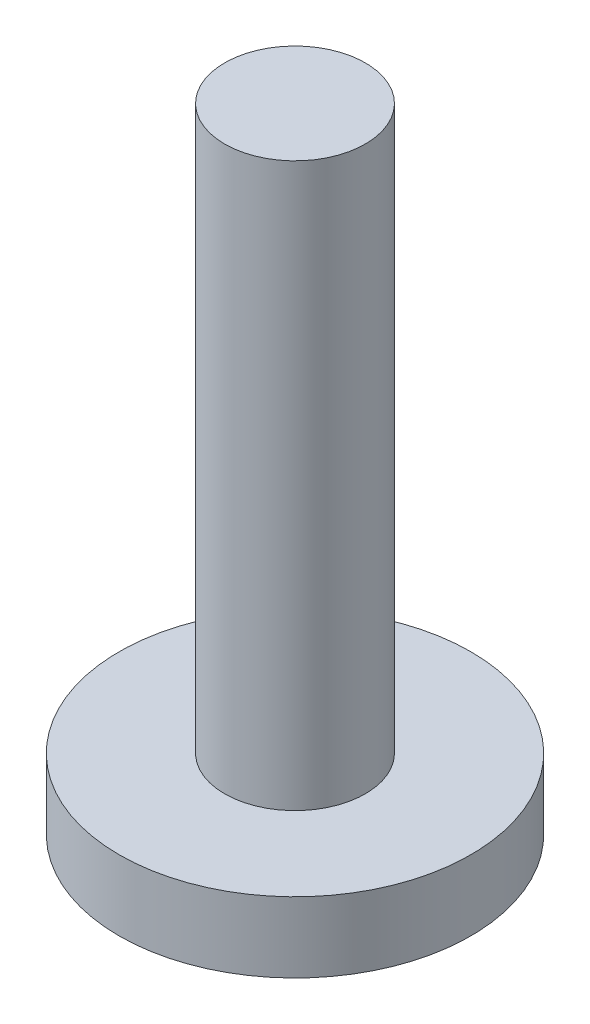
ISO-10303-21;
HEADER;
FILE_DESCRIPTION(('STEP AP214'),'2;1');
FILE_NAME('part.step','',(''),(''),'','','');
FILE_SCHEMA(('AUTOMOTIVE_DESIGN { 1 0 10303 214 1 1 1 1 }'));
ENDSEC;
DATA;
#1=APPLICATION_CONTEXT('core data for automotive mechanical design processes');
#2=APPLICATION_PROTOCOL_DEFINITION('international standard','automotive_design',2000,#1);
#3=PRODUCT_CONTEXT('',#1,'mechanical');
#4=PRODUCT('Part','Part','',(#3));
#5=PRODUCT_RELATED_PRODUCT_CATEGORY('part','',(#4));
#6=PRODUCT_DEFINITION_FORMATION('','',#4);
#7=PRODUCT_DEFINITION_CONTEXT('part definition',#1,'design');
#8=PRODUCT_DEFINITION('design','',#6,#7);
#9=PRODUCT_DEFINITION_SHAPE('','',#8);
#10=(LENGTH_UNIT() NAMED_UNIT(*) SI_UNIT(.MILLI.,.METRE.));
#11=(NAMED_UNIT(*) PLANE_ANGLE_UNIT() SI_UNIT($,.RADIAN.));
#12=(NAMED_UNIT(*) SI_UNIT($,.STERADIAN.) SOLID_ANGLE_UNIT());
#13=UNCERTAINTY_MEASURE_WITH_UNIT(LENGTH_MEASURE(1.E-05),#10,'distance_accuracy_value','');
#14=(GEOMETRIC_REPRESENTATION_CONTEXT(3) GLOBAL_UNCERTAINTY_ASSIGNED_CONTEXT((#13)) GLOBAL_UNIT_ASSIGNED_CONTEXT((#10,
#11,#12)) REPRESENTATION_CONTEXT('',''));
#15=CARTESIAN_POINT('',(0.,0.,0.));
#16=DIRECTION('',(0.,0.,1.));
#17=DIRECTION('',(1.,0.,0.));
#18=AXIS2_PLACEMENT_3D('',#15,#16,#17);
#19=CARTESIAN_POINT('',(0.,4.,0.));
#20=DIRECTION('',(0.,-1.,0.));
#21=DIRECTION('',(0.,0.,-1.));
#22=AXIS2_PLACEMENT_3D('',#19,#20,#21);
#23=CYLINDRICAL_SURFACE('',#22,0.5);
#24=CARTESIAN_POINT('',(0.,4.,0.));
#25=DIRECTION('',(0.,1.,0.));
#26=DIRECTION('',(0.,0.,1.));
#27=AXIS2_PLACEMENT_3D('',#24,#25,#26);
#28=CIRCLE('',#27,0.5);
#29=CARTESIAN_POINT('',(0.,4.,0.5));
#30=VERTEX_POINT('',#29);
#31=EDGE_CURVE('E11',#30,#30,#28,.T.);
#32=ORIENTED_EDGE('',*,*,#31,.F.);
#33=EDGE_LOOP('',(#32));
#34=FACE_BOUND('',#33,.T.);
#35=CARTESIAN_POINT('',(0.,0.,0.));
#36=DIRECTION('',(0.,1.,0.));
#37=DIRECTION('',(0.,0.,1.));
#38=AXIS2_PLACEMENT_3D('',#35,#36,#37);
#39=CIRCLE('',#38,0.5);
#40=CARTESIAN_POINT('',(0.,0.,0.5));
#41=VERTEX_POINT('',#40);
#42=EDGE_CURVE('E49',#41,#41,#39,.T.);
#43=ORIENTED_EDGE('',*,*,#42,.T.);
#44=EDGE_LOOP('',(#43));
#45=FACE_BOUND('',#44,.T.);
#46=ADVANCED_FACE('F50',(#34,#45),#23,.T.);
#47=CARTESIAN_POINT('',(0.,4.,0.));
#48=DIRECTION('',(0.,1.,0.));
#49=DIRECTION('',(0.,0.,1.));
#50=AXIS2_PLACEMENT_3D('',#47,#48,#49);
#51=PLANE('',#50);
#52=ORIENTED_EDGE('',*,*,#31,.T.);
#53=EDGE_LOOP('',(#52));
#54=FACE_BOUND('',#53,.T.);
#55=ADVANCED_FACE('F280',(#54),#51,.T.);
#56=CARTESIAN_POINT('',(0.,-0.5,0.));
#57=DIRECTION('',(0.,1.,0.));
#58=DIRECTION('',(0.,0.,1.));
#59=AXIS2_PLACEMENT_3D('',#56,#57,#58);
#60=CYLINDRICAL_SURFACE('',#59,1.25);
#61=CARTESIAN_POINT('',(0.,-0.5,0.));
#62=DIRECTION('',(0.,-1.,0.));
#63=DIRECTION('',(0.,0.,-1.));
#64=AXIS2_PLACEMENT_3D('',#61,#62,#63);
#65=CIRCLE('',#64,1.25);
#66=CARTESIAN_POINT('',(0.,-0.5,-1.25));
#67=VERTEX_POINT('',#66);
#68=EDGE_CURVE('E246',#67,#67,#65,.T.);
#69=ORIENTED_EDGE('',*,*,#68,.F.);
#70=EDGE_LOOP('',(#69));
#71=FACE_BOUND('',#70,.T.);
#72=CARTESIAN_POINT('',(0.,0.,0.));
#73=DIRECTION('',(0.,-1.,0.));
#74=DIRECTION('',(0.,0.,-1.));
#75=AXIS2_PLACEMENT_3D('',#72,#73,#74);
#76=CIRCLE('',#75,1.25);
#77=CARTESIAN_POINT('',(0.,0.,-1.25));
#78=VERTEX_POINT('',#77);
#79=EDGE_CURVE('E222',#78,#78,#76,.T.);
#80=ORIENTED_EDGE('',*,*,#79,.T.);
#81=EDGE_LOOP('',(#80));
#82=FACE_BOUND('',#81,.T.);
#83=ADVANCED_FACE('F260',(#71,#82),#60,.T.);
#84=CARTESIAN_POINT('',(0.,-0.5,0.));
#85=DIRECTION('',(0.,-1.,0.));
#86=DIRECTION('',(0.,0.,-1.));
#87=AXIS2_PLACEMENT_3D('',#84,#85,#86);
#88=PLANE('',#87);
#89=DIRECTION('',(0.,0.,1.));
#90=VECTOR('',#89,1.);
#91=CARTESIAN_POINT('',(0.0499999999999999,-0.5,0.85));
#92=LINE('',#91,#90);
#93=CARTESIAN_POINT('',(0.0500000000000001,-0.5,0.05));
#94=VERTEX_POINT('',#93);
#95=CARTESIAN_POINT('',(0.0499999999999999,-0.5,0.85));
#96=VERTEX_POINT('',#95);
#97=EDGE_CURVE('E65',#94,#96,#92,.T.);
#98=ORIENTED_EDGE('',*,*,#97,.F.);
#99=DIRECTION('',(-1.,0.,0.));
#100=VECTOR('',#99,1.);
#101=CARTESIAN_POINT('',(0.0500000000000001,-0.5,0.05));
#102=LINE('',#101,#100);
#103=CARTESIAN_POINT('',(0.85,-0.5,0.05));
#104=VERTEX_POINT('',#103);
#105=EDGE_CURVE('E214',#104,#94,#102,.T.);
#106=ORIENTED_EDGE('',*,*,#105,.F.);
#107=DIRECTION('',(0.,0.,1.));
#108=VECTOR('',#107,1.);
#109=CARTESIAN_POINT('',(0.85,-0.5,0.05));
#110=LINE('',#109,#108);
#111=CARTESIAN_POINT('',(0.85,-0.5,-0.05));
#112=VERTEX_POINT('',#111);
#113=EDGE_CURVE('E215',#112,#104,#110,.T.);
#114=ORIENTED_EDGE('',*,*,#113,.F.);
#115=DIRECTION('',(1.,0.,0.));
#116=VECTOR('',#115,1.);
#117=CARTESIAN_POINT('',(0.0500000000000001,-0.5,-0.05));
#118=LINE('',#117,#116);
#119=CARTESIAN_POINT('',(0.0500000000000001,-0.5,-0.05));
#120=VERTEX_POINT('',#119);
#121=EDGE_CURVE('E148',#120,#112,#118,.T.);
#122=ORIENTED_EDGE('',*,*,#121,.F.);
#123=DIRECTION('',(0.,0.,1.));
#124=VECTOR('',#123,1.);
#125=CARTESIAN_POINT('',(0.0499999999999999,-0.5,-0.85));
#126=LINE('',#125,#124);
#127=CARTESIAN_POINT('',(0.0499999999999999,-0.5,-0.85));
#128=VERTEX_POINT('',#127);
#129=EDGE_CURVE('E206',#128,#120,#126,.T.);
#130=ORIENTED_EDGE('',*,*,#129,.F.);
#131=DIRECTION('',(1.,0.,0.));
#132=VECTOR('',#131,1.);
#133=CARTESIAN_POINT('',(-0.0499999999999999,-0.5,-0.85));
#134=LINE('',#133,#132);
#135=CARTESIAN_POINT('',(-0.0499999999999999,-0.5,-0.85));
#136=VERTEX_POINT('',#135);
#137=EDGE_CURVE('E205',#136,#128,#134,.T.);
#138=ORIENTED_EDGE('',*,*,#137,.F.);
#139=DIRECTION('',(0.,0.,-1.));
#140=VECTOR('',#139,1.);
#141=CARTESIAN_POINT('',(-0.0499999999999999,-0.5,-0.85));
#142=LINE('',#141,#140);
#143=CARTESIAN_POINT('',(-0.0500000000000001,-0.5,-0.05));
#144=VERTEX_POINT('',#143);
#145=EDGE_CURVE('E196',#144,#136,#142,.T.);
#146=ORIENTED_EDGE('',*,*,#145,.F.);
#147=DIRECTION('',(1.,0.,0.));
#148=VECTOR('',#147,1.);
#149=CARTESIAN_POINT('',(-0.0500000000000001,-0.5,-0.05));
#150=LINE('',#149,#148);
#151=CARTESIAN_POINT('',(-0.85,-0.5,-0.05));
#152=VERTEX_POINT('',#151);
#153=EDGE_CURVE('E191',#152,#144,#150,.T.);
#154=ORIENTED_EDGE('',*,*,#153,.F.);
#155=DIRECTION('',(0.,0.,-1.));
#156=VECTOR('',#155,1.);
#157=CARTESIAN_POINT('',(-0.85,-0.5,0.05));
#158=LINE('',#157,#156);
#159=CARTESIAN_POINT('',(-0.85,-0.5,0.05));
#160=VERTEX_POINT('',#159);
#161=EDGE_CURVE('E188',#160,#152,#158,.T.);
#162=ORIENTED_EDGE('',*,*,#161,.F.);
#163=DIRECTION('',(-1.,0.,0.));
#164=VECTOR('',#163,1.);
#165=CARTESIAN_POINT('',(-0.0500000000000001,-0.5,0.05));
#166=LINE('',#165,#164);
#167=CARTESIAN_POINT('',(-0.0500000000000001,-0.5,0.05));
#168=VERTEX_POINT('',#167);
#169=EDGE_CURVE('E187',#168,#160,#166,.T.);
#170=ORIENTED_EDGE('',*,*,#169,.F.);
#171=DIRECTION('',(0.,0.,-1.));
#172=VECTOR('',#171,1.);
#173=CARTESIAN_POINT('',(-0.0499999999999999,-0.5,0.85));
#174=LINE('',#173,#172);
#175=CARTESIAN_POINT('',(-0.0499999999999999,-0.5,0.85));
#176=VERTEX_POINT('',#175);
#177=EDGE_CURVE('E185',#176,#168,#174,.T.);
#178=ORIENTED_EDGE('',*,*,#177,.F.);
#179=DIRECTION('',(-1.,0.,0.));
#180=VECTOR('',#179,1.);
#181=CARTESIAN_POINT('',(-0.0499999999999999,-0.5,0.85));
#182=LINE('',#181,#180);
#183=EDGE_CURVE('E179',#96,#176,#182,.T.);
#184=ORIENTED_EDGE('',*,*,#183,.F.);
#185=EDGE_LOOP('',(#98,#106,#114,#122,#130,#138,#146,#154,#162,#170,#178,#184));
#186=FACE_BOUND('',#185,.T.);
#187=ORIENTED_EDGE('',*,*,#68,.T.);
#188=EDGE_LOOP('',(#187));
#189=FACE_BOUND('',#188,.T.);
#190=ADVANCED_FACE('F265',(#186,#189),#88,.T.);
#191=CARTESIAN_POINT('',(0.,0.,0.));
#192=DIRECTION('',(0.,-1.,0.));
#193=DIRECTION('',(0.,0.,-1.));
#194=AXIS2_PLACEMENT_3D('',#191,#192,#193);
#195=PLANE('',#194);
#196=ORIENTED_EDGE('',*,*,#42,.F.);
#197=EDGE_LOOP('',(#196));
#198=FACE_BOUND('',#197,.T.);
#199=ORIENTED_EDGE('',*,*,#79,.F.);
#200=EDGE_LOOP('',(#199));
#201=FACE_BOUND('',#200,.T.);
#202=ADVANCED_FACE('F259',(#198,#201),#195,.F.);
#203=CARTESIAN_POINT('',(0.0499999999999999,-0.2,0.85));
#204=DIRECTION('',(1.,0.,0.));
#205=DIRECTION('',(0.,0.,-1.));
#206=AXIS2_PLACEMENT_3D('',#203,#204,#205);
#207=PLANE('',#206);
#208=ORIENTED_EDGE('',*,*,#97,.T.);
#209=DIRECTION('',(0.,-1.,0.));
#210=VECTOR('',#209,1.);
#211=CARTESIAN_POINT('',(0.0499999999999999,-0.2,0.85));
#212=LINE('',#211,#210);
#213=CARTESIAN_POINT('',(0.0499999999999999,-0.2,0.85));
#214=VERTEX_POINT('',#213);
#215=EDGE_CURVE('E109',#214,#96,#212,.T.);
#216=ORIENTED_EDGE('',*,*,#215,.F.);
#217=DIRECTION('',(0.,0.,1.));
#218=VECTOR('',#217,1.);
#219=CARTESIAN_POINT('',(0.0499999999999999,-0.2,0.85));
#220=LINE('',#219,#218);
#221=CARTESIAN_POINT('',(0.0500000000000001,-0.2,0.05));
#222=VERTEX_POINT('',#221);
#223=EDGE_CURVE('E217',#222,#214,#220,.T.);
#224=ORIENTED_EDGE('',*,*,#223,.F.);
#225=DIRECTION('',(0.,-1.,0.));
#226=VECTOR('',#225,1.);
#227=CARTESIAN_POINT('',(0.0500000000000001,-0.2,0.05));
#228=LINE('',#227,#226);
#229=EDGE_CURVE('E68',#222,#94,#228,.T.);
#230=ORIENTED_EDGE('',*,*,#229,.T.);
#231=EDGE_LOOP('',(#208,#216,#224,#230));
#232=FACE_BOUND('',#231,.T.);
#233=ADVANCED_FACE('F261',(#232),#207,.F.);
#234=CARTESIAN_POINT('',(0.0500000000000001,-0.2,0.05));
#235=DIRECTION('',(0.,0.,1.));
#236=DIRECTION('',(1.,0.,0.));
#237=AXIS2_PLACEMENT_3D('',#234,#235,#236);
#238=PLANE('',#237);
#239=ORIENTED_EDGE('',*,*,#105,.T.);
#240=ORIENTED_EDGE('',*,*,#229,.F.);
#241=DIRECTION('',(-1.,0.,0.));
#242=VECTOR('',#241,1.);
#243=CARTESIAN_POINT('',(0.0500000000000001,-0.2,0.05));
#244=LINE('',#243,#242);
#245=CARTESIAN_POINT('',(0.85,-0.2,0.05));
#246=VERTEX_POINT('',#245);
#247=EDGE_CURVE('E159',#246,#222,#244,.T.);
#248=ORIENTED_EDGE('',*,*,#247,.F.);
#249=DIRECTION('',(0.,-1.,0.));
#250=VECTOR('',#249,1.);
#251=CARTESIAN_POINT('',(0.85,-0.2,0.05));
#252=LINE('',#251,#250);
#253=EDGE_CURVE('E151',#246,#104,#252,.T.);
#254=ORIENTED_EDGE('',*,*,#253,.T.);
#255=EDGE_LOOP('',(#239,#240,#248,#254));
#256=FACE_BOUND('',#255,.T.);
#257=ADVANCED_FACE('F269',(#256),#238,.F.);
#258=CARTESIAN_POINT('',(0.85,-0.2,0.05));
#259=DIRECTION('',(1.,0.,0.));
#260=DIRECTION('',(0.,0.,-1.));
#261=AXIS2_PLACEMENT_3D('',#258,#259,#260);
#262=PLANE('',#261);
#263=ORIENTED_EDGE('',*,*,#113,.T.);
#264=ORIENTED_EDGE('',*,*,#253,.F.);
#265=DIRECTION('',(0.,0.,1.));
#266=VECTOR('',#265,1.);
#267=CARTESIAN_POINT('',(0.85,-0.2,0.05));
#268=LINE('',#267,#266);
#269=CARTESIAN_POINT('',(0.85,-0.2,-0.05));
#270=VERTEX_POINT('',#269);
#271=EDGE_CURVE('E154',#270,#246,#268,.T.);
#272=ORIENTED_EDGE('',*,*,#271,.F.);
#273=DIRECTION('',(0.,-1.,0.));
#274=VECTOR('',#273,1.);
#275=CARTESIAN_POINT('',(0.85,-0.2,-0.05));
#276=LINE('',#275,#274);
#277=EDGE_CURVE('E136',#270,#112,#276,.T.);
#278=ORIENTED_EDGE('',*,*,#277,.T.);
#279=EDGE_LOOP('',(#263,#264,#272,#278));
#280=FACE_BOUND('',#279,.T.);
#281=ADVANCED_FACE('F156',(#280),#262,.F.);
#282=CARTESIAN_POINT('',(0.0500000000000001,-0.2,-0.05));
#283=DIRECTION('',(0.,0.,-1.));
#284=DIRECTION('',(-1.,0.,0.));
#285=AXIS2_PLACEMENT_3D('',#282,#283,#284);
#286=PLANE('',#285);
#287=ORIENTED_EDGE('',*,*,#121,.T.);
#288=ORIENTED_EDGE('',*,*,#277,.F.);
#289=DIRECTION('',(1.,0.,0.));
#290=VECTOR('',#289,1.);
#291=CARTESIAN_POINT('',(0.0500000000000001,-0.2,-0.05));
#292=LINE('',#291,#290);
#293=CARTESIAN_POINT('',(0.0500000000000001,-0.2,-0.05));
#294=VERTEX_POINT('',#293);
#295=EDGE_CURVE('E141',#294,#270,#292,.T.);
#296=ORIENTED_EDGE('',*,*,#295,.F.);
#297=DIRECTION('',(0.,-1.,0.));
#298=VECTOR('',#297,1.);
#299=CARTESIAN_POINT('',(0.0500000000000001,-0.2,-0.05));
#300=LINE('',#299,#298);
#301=EDGE_CURVE('E155',#294,#120,#300,.T.);
#302=ORIENTED_EDGE('',*,*,#301,.T.);
#303=EDGE_LOOP('',(#287,#288,#296,#302));
#304=FACE_BOUND('',#303,.T.);
#305=ADVANCED_FACE('F143',(#304),#286,.F.);
#306=CARTESIAN_POINT('',(0.0499999999999999,-0.2,-0.85));
#307=DIRECTION('',(1.,0.,0.));
#308=DIRECTION('',(0.,0.,-1.));
#309=AXIS2_PLACEMENT_3D('',#306,#307,#308);
#310=PLANE('',#309);
#311=ORIENTED_EDGE('',*,*,#129,.T.);
#312=ORIENTED_EDGE('',*,*,#301,.F.);
#313=DIRECTION('',(0.,0.,1.));
#314=VECTOR('',#313,1.);
#315=CARTESIAN_POINT('',(0.0499999999999999,-0.2,-0.85));
#316=LINE('',#315,#314);
#317=CARTESIAN_POINT('',(0.0499999999999999,-0.2,-0.85));
#318=VERTEX_POINT('',#317);
#319=EDGE_CURVE('E167',#318,#294,#316,.T.);
#320=ORIENTED_EDGE('',*,*,#319,.F.);
#321=DIRECTION('',(0.,-1.,0.));
#322=VECTOR('',#321,1.);
#323=CARTESIAN_POINT('',(0.0499999999999999,-0.2,-0.85));
#324=LINE('',#323,#322);
#325=EDGE_CURVE('E227',#318,#128,#324,.T.);
#326=ORIENTED_EDGE('',*,*,#325,.T.);
#327=EDGE_LOOP('',(#311,#312,#320,#326));
#328=FACE_BOUND('',#327,.T.);
#329=ADVANCED_FACE('F336',(#328),#310,.F.);
#330=CARTESIAN_POINT('',(-0.0499999999999999,-0.2,-0.85));
#331=DIRECTION('',(0.,0.,-1.));
#332=DIRECTION('',(-1.,0.,0.));
#333=AXIS2_PLACEMENT_3D('',#330,#331,#332);
#334=PLANE('',#333);
#335=ORIENTED_EDGE('',*,*,#137,.T.);
#336=ORIENTED_EDGE('',*,*,#325,.F.);
#337=DIRECTION('',(1.,0.,0.));
#338=VECTOR('',#337,1.);
#339=CARTESIAN_POINT('',(-0.0499999999999999,-0.2,-0.85));
#340=LINE('',#339,#338);
#341=CARTESIAN_POINT('',(-0.0499999999999999,-0.2,-0.85));
#342=VERTEX_POINT('',#341);
#343=EDGE_CURVE('E168',#342,#318,#340,.T.);
#344=ORIENTED_EDGE('',*,*,#343,.F.);
#345=DIRECTION('',(0.,-1.,0.));
#346=VECTOR('',#345,1.);
#347=CARTESIAN_POINT('',(-0.0499999999999999,-0.2,-0.85));
#348=LINE('',#347,#346);
#349=EDGE_CURVE('E226',#342,#136,#348,.T.);
#350=ORIENTED_EDGE('',*,*,#349,.T.);
#351=EDGE_LOOP('',(#335,#336,#344,#350));
#352=FACE_BOUND('',#351,.T.);
#353=ADVANCED_FACE('F346',(#352),#334,.F.);
#354=CARTESIAN_POINT('',(-0.0499999999999999,-0.2,-0.85));
#355=DIRECTION('',(-1.,0.,0.));
#356=DIRECTION('',(0.,0.,1.));
#357=AXIS2_PLACEMENT_3D('',#354,#355,#356);
#358=PLANE('',#357);
#359=ORIENTED_EDGE('',*,*,#145,.T.);
#360=ORIENTED_EDGE('',*,*,#349,.F.);
#361=DIRECTION('',(0.,0.,-1.));
#362=VECTOR('',#361,1.);
#363=CARTESIAN_POINT('',(-0.0499999999999999,-0.2,-0.85));
#364=LINE('',#363,#362);
#365=CARTESIAN_POINT('',(-0.0500000000000001,-0.2,-0.05));
#366=VERTEX_POINT('',#365);
#367=EDGE_CURVE('E456',#366,#342,#364,.T.);
#368=ORIENTED_EDGE('',*,*,#367,.F.);
#369=DIRECTION('',(0.,-1.,0.));
#370=VECTOR('',#369,1.);
#371=CARTESIAN_POINT('',(-0.0500000000000001,-0.2,-0.05));
#372=LINE('',#371,#370);
#373=EDGE_CURVE('E235',#366,#144,#372,.T.);
#374=ORIENTED_EDGE('',*,*,#373,.T.);
#375=EDGE_LOOP('',(#359,#360,#368,#374));
#376=FACE_BOUND('',#375,.T.);
#377=ADVANCED_FACE('F359',(#376),#358,.F.);
#378=CARTESIAN_POINT('',(-0.0500000000000001,-0.2,-0.05));
#379=DIRECTION('',(0.,0.,-1.));
#380=DIRECTION('',(-1.,0.,0.));
#381=AXIS2_PLACEMENT_3D('',#378,#379,#380);
#382=PLANE('',#381);
#383=ORIENTED_EDGE('',*,*,#153,.T.);
#384=ORIENTED_EDGE('',*,*,#373,.F.);
#385=DIRECTION('',(1.,0.,0.));
#386=VECTOR('',#385,1.);
#387=CARTESIAN_POINT('',(-0.0500000000000001,-0.2,-0.05));
#388=LINE('',#387,#386);
#389=CARTESIAN_POINT('',(-0.85,-0.2,-0.05));
#390=VERTEX_POINT('',#389);
#391=EDGE_CURVE('E451',#390,#366,#388,.T.);
#392=ORIENTED_EDGE('',*,*,#391,.F.);
#393=DIRECTION('',(0.,-1.,0.));
#394=VECTOR('',#393,1.);
#395=CARTESIAN_POINT('',(-0.85,-0.2,-0.05));
#396=LINE('',#395,#394);
#397=EDGE_CURVE('E233',#390,#152,#396,.T.);
#398=ORIENTED_EDGE('',*,*,#397,.T.);
#399=EDGE_LOOP('',(#383,#384,#392,#398));
#400=FACE_BOUND('',#399,.T.);
#401=ADVANCED_FACE('F366',(#400),#382,.F.);
#402=CARTESIAN_POINT('',(-0.85,-0.2,0.05));
#403=DIRECTION('',(-1.,0.,0.));
#404=DIRECTION('',(0.,0.,1.));
#405=AXIS2_PLACEMENT_3D('',#402,#403,#404);
#406=PLANE('',#405);
#407=ORIENTED_EDGE('',*,*,#161,.T.);
#408=ORIENTED_EDGE('',*,*,#397,.F.);
#409=DIRECTION('',(0.,0.,-1.));
#410=VECTOR('',#409,1.);
#411=CARTESIAN_POINT('',(-0.85,-0.2,0.05));
#412=LINE('',#411,#410);
#413=CARTESIAN_POINT('',(-0.85,-0.2,0.05));
#414=VERTEX_POINT('',#413);
#415=EDGE_CURVE('E448',#414,#390,#412,.T.);
#416=ORIENTED_EDGE('',*,*,#415,.F.);
#417=DIRECTION('',(0.,-1.,0.));
#418=VECTOR('',#417,1.);
#419=CARTESIAN_POINT('',(-0.85,-0.2,0.05));
#420=LINE('',#419,#418);
#421=EDGE_CURVE('E236',#414,#160,#420,.T.);
#422=ORIENTED_EDGE('',*,*,#421,.T.);
#423=EDGE_LOOP('',(#407,#408,#416,#422));
#424=FACE_BOUND('',#423,.T.);
#425=ADVANCED_FACE('F378',(#424),#406,.F.);
#426=CARTESIAN_POINT('',(-0.0500000000000001,-0.2,0.05));
#427=DIRECTION('',(0.,0.,1.));
#428=DIRECTION('',(1.,0.,0.));
#429=AXIS2_PLACEMENT_3D('',#426,#427,#428);
#430=PLANE('',#429);
#431=ORIENTED_EDGE('',*,*,#169,.T.);
#432=ORIENTED_EDGE('',*,*,#421,.F.);
#433=DIRECTION('',(-1.,0.,0.));
#434=VECTOR('',#433,1.);
#435=CARTESIAN_POINT('',(-0.0500000000000001,-0.2,0.05));
#436=LINE('',#435,#434);
#437=CARTESIAN_POINT('',(-0.0500000000000001,-0.2,0.05));
#438=VERTEX_POINT('',#437);
#439=EDGE_CURVE('E439',#438,#414,#436,.T.);
#440=ORIENTED_EDGE('',*,*,#439,.F.);
#441=DIRECTION('',(0.,-1.,0.));
#442=VECTOR('',#441,1.);
#443=CARTESIAN_POINT('',(-0.0500000000000001,-0.2,0.05));
#444=LINE('',#443,#442);
#445=EDGE_CURVE('E242',#438,#168,#444,.T.);
#446=ORIENTED_EDGE('',*,*,#445,.T.);
#447=EDGE_LOOP('',(#431,#432,#440,#446));
#448=FACE_BOUND('',#447,.T.);
#449=ADVANCED_FACE('F389',(#448),#430,.F.);
#450=CARTESIAN_POINT('',(-0.0499999999999999,-0.2,0.85));
#451=DIRECTION('',(-1.,0.,0.));
#452=DIRECTION('',(0.,0.,1.));
#453=AXIS2_PLACEMENT_3D('',#450,#451,#452);
#454=PLANE('',#453);
#455=ORIENTED_EDGE('',*,*,#177,.T.);
#456=ORIENTED_EDGE('',*,*,#445,.F.);
#457=DIRECTION('',(0.,0.,-1.));
#458=VECTOR('',#457,1.);
#459=CARTESIAN_POINT('',(-0.0499999999999999,-0.2,0.85));
#460=LINE('',#459,#458);
#461=CARTESIAN_POINT('',(-0.0499999999999999,-0.2,0.85));
#462=VERTEX_POINT('',#461);
#463=EDGE_CURVE('E436',#462,#438,#460,.T.);
#464=ORIENTED_EDGE('',*,*,#463,.F.);
#465=DIRECTION('',(0.,-1.,0.));
#466=VECTOR('',#465,1.);
#467=CARTESIAN_POINT('',(-0.0499999999999999,-0.2,0.85));
#468=LINE('',#467,#466);
#469=EDGE_CURVE('E241',#462,#176,#468,.T.);
#470=ORIENTED_EDGE('',*,*,#469,.T.);
#471=EDGE_LOOP('',(#455,#456,#464,#470));
#472=FACE_BOUND('',#471,.T.);
#473=ADVANCED_FACE('F399',(#472),#454,.F.);
#474=CARTESIAN_POINT('',(-0.0499999999999999,-0.2,0.85));
#475=DIRECTION('',(0.,0.,1.));
#476=DIRECTION('',(1.,0.,0.));
#477=AXIS2_PLACEMENT_3D('',#474,#475,#476);
#478=PLANE('',#477);
#479=ORIENTED_EDGE('',*,*,#183,.T.);
#480=ORIENTED_EDGE('',*,*,#469,.F.);
#481=DIRECTION('',(-1.,0.,0.));
#482=VECTOR('',#481,1.);
#483=CARTESIAN_POINT('',(-0.0499999999999999,-0.2,0.85));
#484=LINE('',#483,#482);
#485=EDGE_CURVE('E442',#214,#462,#484,.T.);
#486=ORIENTED_EDGE('',*,*,#485,.F.);
#487=ORIENTED_EDGE('',*,*,#215,.T.);
#488=EDGE_LOOP('',(#479,#480,#486,#487));
#489=FACE_BOUND('',#488,.T.);
#490=ADVANCED_FACE('F409',(#489),#478,.F.);
#491=CARTESIAN_POINT('',(0.,-0.2,0.));
#492=DIRECTION('',(0.,-1.,0.));
#493=DIRECTION('',(0.,0.,-1.));
#494=AXIS2_PLACEMENT_3D('',#491,#492,#493);
#495=PLANE('',#494);
#496=ORIENTED_EDGE('',*,*,#223,.T.);
#497=ORIENTED_EDGE('',*,*,#485,.T.);
#498=ORIENTED_EDGE('',*,*,#463,.T.);
#499=ORIENTED_EDGE('',*,*,#439,.T.);
#500=ORIENTED_EDGE('',*,*,#415,.T.);
#501=ORIENTED_EDGE('',*,*,#391,.T.);
#502=ORIENTED_EDGE('',*,*,#367,.T.);
#503=ORIENTED_EDGE('',*,*,#343,.T.);
#504=ORIENTED_EDGE('',*,*,#319,.T.);
#505=ORIENTED_EDGE('',*,*,#295,.T.);
#506=ORIENTED_EDGE('',*,*,#271,.T.);
#507=ORIENTED_EDGE('',*,*,#247,.T.);
#508=EDGE_LOOP('',(#496,#497,#498,#499,#500,#501,#502,#503,#504,#505,#506,#507));
#509=FACE_BOUND('',#508,.T.);
#510=ADVANCED_FACE('F162',(#509),#495,.T.);
#511=CLOSED_SHELL('',(#46,#55,#83,#190,#202,#233,#257,#281,#305,#329,#353,#377,#401,#425,#449,
#473,#490,#510));
#512=MANIFOLD_SOLID_BREP('B2',#511);
#513=ADVANCED_BREP_SHAPE_REPRESENTATION('',(#18,#512),#14);
#514=SHAPE_DEFINITION_REPRESENTATION(#9,#513);
ENDSEC;
END-ISO-10303-21;
